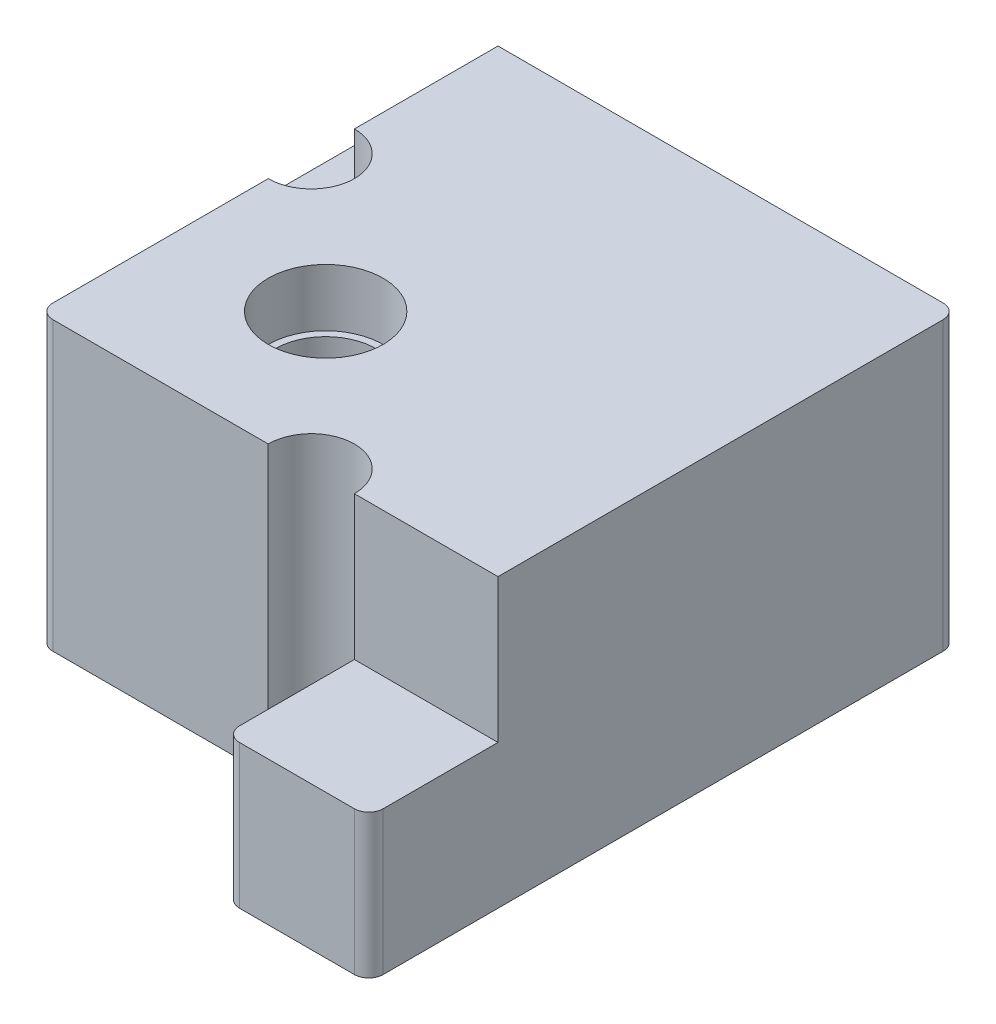
ISO-10303-21;
HEADER;
FILE_DESCRIPTION(('STEP AP214'),'2;1');
FILE_NAME('part.step','',(''),(''),'','','');
FILE_SCHEMA(('AUTOMOTIVE_DESIGN { 1 0 10303 214 1 1 1 1 }'));
ENDSEC;
DATA;
#1=APPLICATION_CONTEXT('core data for automotive mechanical design processes');
#2=APPLICATION_PROTOCOL_DEFINITION('international standard','automotive_design',2000,#1);
#3=PRODUCT_CONTEXT('',#1,'mechanical');
#4=PRODUCT('Part','Part','',(#3));
#5=PRODUCT_RELATED_PRODUCT_CATEGORY('part','',(#4));
#6=PRODUCT_DEFINITION_FORMATION('','',#4);
#7=PRODUCT_DEFINITION_CONTEXT('part definition',#1,'design');
#8=PRODUCT_DEFINITION('design','',#6,#7);
#9=PRODUCT_DEFINITION_SHAPE('','',#8);
#10=(LENGTH_UNIT() NAMED_UNIT(*) SI_UNIT(.MILLI.,.METRE.));
#11=(NAMED_UNIT(*) PLANE_ANGLE_UNIT() SI_UNIT($,.RADIAN.));
#12=(NAMED_UNIT(*) SI_UNIT($,.STERADIAN.) SOLID_ANGLE_UNIT());
#13=UNCERTAINTY_MEASURE_WITH_UNIT(LENGTH_MEASURE(1.E-05),#10,'distance_accuracy_value','');
#14=(GEOMETRIC_REPRESENTATION_CONTEXT(3) GLOBAL_UNCERTAINTY_ASSIGNED_CONTEXT((#13)) GLOBAL_UNIT_ASSIGNED_CONTEXT((#10,
#11,#12)) REPRESENTATION_CONTEXT('',''));
#15=CARTESIAN_POINT('',(0.,0.,0.));
#16=DIRECTION('',(0.,0.,1.));
#17=DIRECTION('',(1.,0.,0.));
#18=AXIS2_PLACEMENT_3D('',#15,#16,#17);
#19=CARTESIAN_POINT('',(0.,10.,0.));
#20=DIRECTION('',(1.,0.,0.));
#21=DIRECTION('',(0.,0.,-1.));
#22=AXIS2_PLACEMENT_3D('',#19,#20,#21);
#23=PLANE('',#22);
#24=DIRECTION('',(0.,0.,1.));
#25=VECTOR('',#24,1.);
#26=CARTESIAN_POINT('',(0.,5.,5.));
#27=LINE('',#26,#25);
#28=CARTESIAN_POINT('',(0.,5.,0.5));
#29=VERTEX_POINT('',#28);
#30=CARTESIAN_POINT('',(0.,5.,4.5));
#31=VERTEX_POINT('',#30);
#32=EDGE_CURVE('E193',#29,#31,#27,.T.);
#33=ORIENTED_EDGE('',*,*,#32,.F.);
#34=DIRECTION('',(0.,-1.,0.));
#35=VECTOR('',#34,1.);
#36=CARTESIAN_POINT('',(0.,10.,0.5));
#37=LINE('',#36,#35);
#38=CARTESIAN_POINT('',(0.,0.,0.5));
#39=VERTEX_POINT('',#38);
#40=EDGE_CURVE('E304',#29,#39,#37,.T.);
#41=ORIENTED_EDGE('',*,*,#40,.T.);
#42=DIRECTION('',(0.,0.,1.));
#43=VECTOR('',#42,1.);
#44=CARTESIAN_POINT('',(0.,0.,0.));
#45=LINE('',#44,#43);
#46=CARTESIAN_POINT('',(0.,0.,4.5));
#47=VERTEX_POINT('',#46);
#48=EDGE_CURVE('E256',#39,#47,#45,.T.);
#49=ORIENTED_EDGE('',*,*,#48,.T.);
#50=DIRECTION('',(0.,-1.,0.));
#51=VECTOR('',#50,1.);
#52=CARTESIAN_POINT('',(0.,10.,4.5));
#53=LINE('',#52,#51);
#54=EDGE_CURVE('E302',#47,#31,#53,.F.);
#55=ORIENTED_EDGE('',*,*,#54,.T.);
#56=EDGE_LOOP('',(#33,#41,#49,#55));
#57=FACE_BOUND('',#56,.T.);
#58=ADVANCED_FACE('F34',(#57),#23,.F.);
#59=CARTESIAN_POINT('',(4.5,10.,5.));
#60=DIRECTION('',(0.,0.,-1.));
#61=DIRECTION('',(-1.,0.,0.));
#62=AXIS2_PLACEMENT_3D('',#59,#60,#61);
#63=PLANE('',#62);
#64=DIRECTION('',(1.,0.,0.));
#65=VECTOR('',#64,1.);
#66=CARTESIAN_POINT('',(4.5,5.,5.));
#67=LINE('',#66,#65);
#68=CARTESIAN_POINT('',(0.500000000000001,5.,5.));
#69=VERTEX_POINT('',#68);
#70=CARTESIAN_POINT('',(4.5,5.,5.));
#71=VERTEX_POINT('',#70);
#72=EDGE_CURVE('E180',#69,#71,#67,.T.);
#73=ORIENTED_EDGE('',*,*,#72,.F.);
#74=DIRECTION('',(0.,-1.,0.));
#75=VECTOR('',#74,1.);
#76=CARTESIAN_POINT('',(0.500000000000001,10.,5.));
#77=LINE('',#76,#75);
#78=CARTESIAN_POINT('',(0.500000000000001,0.,5.));
#79=VERTEX_POINT('',#78);
#80=EDGE_CURVE('E311',#69,#79,#77,.T.);
#81=ORIENTED_EDGE('',*,*,#80,.T.);
#82=DIRECTION('',(1.,0.,0.));
#83=VECTOR('',#82,1.);
#84=CARTESIAN_POINT('',(4.5,0.,5.));
#85=LINE('',#84,#83);
#86=CARTESIAN_POINT('',(4.5,0.,5.));
#87=VERTEX_POINT('',#86);
#88=EDGE_CURVE('E259',#79,#87,#85,.T.);
#89=ORIENTED_EDGE('',*,*,#88,.T.);
#90=DIRECTION('',(0.,-1.,0.));
#91=VECTOR('',#90,1.);
#92=CARTESIAN_POINT('',(4.5,10.,5.));
#93=LINE('',#92,#91);
#94=EDGE_CURVE('E271',#71,#87,#93,.T.);
#95=ORIENTED_EDGE('',*,*,#94,.F.);
#96=EDGE_LOOP('',(#73,#81,#89,#95));
#97=FACE_BOUND('',#96,.T.);
#98=ADVANCED_FACE('F377',(#97),#63,.F.);
#99=CARTESIAN_POINT('',(15.5,10.,16.));
#100=DIRECTION('',(1.,0.,0.));
#101=DIRECTION('',(0.,0.,-1.));
#102=AXIS2_PLACEMENT_3D('',#99,#100,#101);
#103=PLANE('',#102);
#104=DIRECTION('',(0.,0.,1.));
#105=VECTOR('',#104,1.);
#106=CARTESIAN_POINT('',(15.5,0.,16.));
#107=LINE('',#106,#105);
#108=CARTESIAN_POINT('',(15.5,0.,16.));
#109=VERTEX_POINT('',#108);
#110=CARTESIAN_POINT('',(15.5,0.,20.));
#111=VERTEX_POINT('',#110);
#112=EDGE_CURVE('E266',#109,#111,#107,.T.);
#113=ORIENTED_EDGE('',*,*,#112,.T.);
#114=DIRECTION('',(0.,-1.,0.));
#115=VECTOR('',#114,1.);
#116=CARTESIAN_POINT('',(15.5,10.,20.));
#117=LINE('',#116,#115);
#118=CARTESIAN_POINT('',(15.5,5.,20.));
#119=VERTEX_POINT('',#118);
#120=EDGE_CURVE('E49',#111,#119,#117,.F.);
#121=ORIENTED_EDGE('',*,*,#120,.T.);
#122=DIRECTION('',(0.,0.,1.));
#123=VECTOR('',#122,1.);
#124=CARTESIAN_POINT('',(15.5,5.,16.));
#125=LINE('',#124,#123);
#126=CARTESIAN_POINT('',(15.5,5.,16.));
#127=VERTEX_POINT('',#126);
#128=EDGE_CURVE('E200',#127,#119,#125,.T.);
#129=ORIENTED_EDGE('',*,*,#128,.F.);
#130=DIRECTION('',(0.,-1.,0.));
#131=VECTOR('',#130,1.);
#132=CARTESIAN_POINT('',(15.5,10.,16.));
#133=LINE('',#132,#131);
#134=EDGE_CURVE('E251',#127,#109,#133,.T.);
#135=ORIENTED_EDGE('',*,*,#134,.T.);
#136=EDGE_LOOP('',(#113,#121,#129,#135));
#137=FACE_BOUND('',#136,.T.);
#138=ADVANCED_FACE('F347',(#137),#103,.F.);
#139=CARTESIAN_POINT('',(20.5,10.,20.5));
#140=DIRECTION('',(0.,0.,-1.));
#141=DIRECTION('',(-1.,0.,0.));
#142=AXIS2_PLACEMENT_3D('',#139,#140,#141);
#143=PLANE('',#142);
#144=DIRECTION('',(1.,0.,0.));
#145=VECTOR('',#144,1.);
#146=CARTESIAN_POINT('',(15.5,5.,20.5));
#147=LINE('',#146,#145);
#148=CARTESIAN_POINT('',(16.,5.,20.5));
#149=VERTEX_POINT('',#148);
#150=CARTESIAN_POINT('',(20.,5.,20.5));
#151=VERTEX_POINT('',#150);
#152=EDGE_CURVE('E202',#149,#151,#147,.T.);
#153=ORIENTED_EDGE('',*,*,#152,.F.);
#154=DIRECTION('',(0.,-1.,0.));
#155=VECTOR('',#154,1.);
#156=CARTESIAN_POINT('',(16.,10.,20.5));
#157=LINE('',#156,#155);
#158=CARTESIAN_POINT('',(16.,0.,20.5));
#159=VERTEX_POINT('',#158);
#160=EDGE_CURVE('E320',#149,#159,#157,.T.);
#161=ORIENTED_EDGE('',*,*,#160,.T.);
#162=DIRECTION('',(1.,0.,0.));
#163=VECTOR('',#162,1.);
#164=CARTESIAN_POINT('',(20.5,0.,20.5));
#165=LINE('',#164,#163);
#166=CARTESIAN_POINT('',(20.,0.,20.5));
#167=VERTEX_POINT('',#166);
#168=EDGE_CURVE('E244',#159,#167,#165,.T.);
#169=ORIENTED_EDGE('',*,*,#168,.T.);
#170=DIRECTION('',(0.,-1.,0.));
#171=VECTOR('',#170,1.);
#172=CARTESIAN_POINT('',(20.,10.,20.5));
#173=LINE('',#172,#171);
#174=EDGE_CURVE('E57',#167,#151,#173,.F.);
#175=ORIENTED_EDGE('',*,*,#174,.T.);
#176=EDGE_LOOP('',(#153,#161,#169,#175));
#177=FACE_BOUND('',#176,.T.);
#178=ADVANCED_FACE('F340',(#177),#143,.F.);
#179=CARTESIAN_POINT('',(9.5,0.,11.));
#180=DIRECTION('',(0.,1.,0.));
#181=DIRECTION('',(0.,0.,1.));
#182=AXIS2_PLACEMENT_3D('',#179,#180,#181);
#183=CYLINDRICAL_SURFACE('',#182,1.75);
#184=CARTESIAN_POINT('',(9.5,0.,11.));
#185=DIRECTION('',(0.,1.,0.));
#186=DIRECTION('',(0.,0.,1.));
#187=AXIS2_PLACEMENT_3D('',#184,#185,#186);
#188=CIRCLE('',#187,1.75);
#189=CARTESIAN_POINT('',(9.5,0.,12.75));
#190=VERTEX_POINT('',#189);
#191=EDGE_CURVE('E236',#190,#190,#188,.T.);
#192=ORIENTED_EDGE('',*,*,#191,.F.);
#193=EDGE_LOOP('',(#192));
#194=FACE_BOUND('',#193,.T.);
#195=CARTESIAN_POINT('',(9.5,8.,11.));
#196=DIRECTION('',(0.,1.,0.));
#197=DIRECTION('',(0.,0.,1.));
#198=AXIS2_PLACEMENT_3D('',#195,#196,#197);
#199=CIRCLE('',#198,1.75);
#200=CARTESIAN_POINT('',(9.5,8.,12.75));
#201=VERTEX_POINT('',#200);
#202=EDGE_CURVE('E233',#201,#201,#199,.F.);
#203=ORIENTED_EDGE('',*,*,#202,.F.);
#204=EDGE_LOOP('',(#203));
#205=FACE_BOUND('',#204,.T.);
#206=ADVANCED_FACE('F416',(#194,#205),#183,.F.);
#207=CARTESIAN_POINT('',(20.5,10.,0.));
#208=DIRECTION('',(-1.,0.,0.));
#209=DIRECTION('',(0.,0.,1.));
#210=AXIS2_PLACEMENT_3D('',#207,#208,#209);
#211=PLANE('',#210);
#212=DIRECTION('',(0.,0.,-1.));
#213=VECTOR('',#212,1.);
#214=CARTESIAN_POINT('',(20.5,0.,0.));
#215=LINE('',#214,#213);
#216=CARTESIAN_POINT('',(20.5,0.,20.));
#217=VERTEX_POINT('',#216);
#218=CARTESIAN_POINT('',(20.5,0.,0.5));
#219=VERTEX_POINT('',#218);
#220=EDGE_CURVE('E239',#217,#219,#215,.T.);
#221=ORIENTED_EDGE('',*,*,#220,.T.);
#222=DIRECTION('',(0.,-1.,0.));
#223=VECTOR('',#222,1.);
#224=CARTESIAN_POINT('',(20.5,10.,0.5));
#225=LINE('',#224,#223);
#226=CARTESIAN_POINT('',(20.5,10.,0.5));
#227=VERTEX_POINT('',#226);
#228=EDGE_CURVE('E296',#219,#227,#225,.F.);
#229=ORIENTED_EDGE('',*,*,#228,.T.);
#230=DIRECTION('',(0.,0.,-1.));
#231=VECTOR('',#230,1.);
#232=CARTESIAN_POINT('',(20.5,10.,0.));
#233=LINE('',#232,#231);
#234=CARTESIAN_POINT('',(20.5,10.,16.));
#235=VERTEX_POINT('',#234);
#236=EDGE_CURVE('E240',#235,#227,#233,.T.);
#237=ORIENTED_EDGE('',*,*,#236,.F.);
#238=DIRECTION('',(0.,1.,0.));
#239=VECTOR('',#238,1.);
#240=CARTESIAN_POINT('',(20.5,5.,16.));
#241=LINE('',#240,#239);
#242=CARTESIAN_POINT('',(20.5,5.,16.));
#243=VERTEX_POINT('',#242);
#244=EDGE_CURVE('E209',#243,#235,#241,.T.);
#245=ORIENTED_EDGE('',*,*,#244,.F.);
#246=DIRECTION('',(0.,0.,-1.));
#247=VECTOR('',#246,1.);
#248=CARTESIAN_POINT('',(20.5,5.,16.));
#249=LINE('',#248,#247);
#250=CARTESIAN_POINT('',(20.5,5.,20.));
#251=VERTEX_POINT('',#250);
#252=EDGE_CURVE('E204',#251,#243,#249,.T.);
#253=ORIENTED_EDGE('',*,*,#252,.F.);
#254=DIRECTION('',(0.,-1.,0.));
#255=VECTOR('',#254,1.);
#256=CARTESIAN_POINT('',(20.5,10.,20.));
#257=LINE('',#256,#255);
#258=EDGE_CURVE('E293',#251,#217,#257,.T.);
#259=ORIENTED_EDGE('',*,*,#258,.T.);
#260=EDGE_LOOP('',(#221,#229,#237,#245,#253,#259));
#261=FACE_BOUND('',#260,.T.);
#262=ADVANCED_FACE('F332',(#261),#211,.F.);
#263=CARTESIAN_POINT('',(0.,10.,0.));
#264=DIRECTION('',(0.,0.,1.));
#265=DIRECTION('',(1.,0.,0.));
#266=AXIS2_PLACEMENT_3D('',#263,#264,#265);
#267=PLANE('',#266);
#268=DIRECTION('',(-1.,0.,0.));
#269=VECTOR('',#268,1.);
#270=CARTESIAN_POINT('',(0.,10.,0.));
#271=LINE('',#270,#269);
#272=CARTESIAN_POINT('',(20.,10.,0.));
#273=VERTEX_POINT('',#272);
#274=CARTESIAN_POINT('',(4.5,10.,0.));
#275=VERTEX_POINT('',#274);
#276=EDGE_CURVE('E243',#273,#275,#271,.T.);
#277=ORIENTED_EDGE('',*,*,#276,.F.);
#278=DIRECTION('',(0.,-1.,0.));
#279=VECTOR('',#278,1.);
#280=CARTESIAN_POINT('',(20.,10.,0.));
#281=LINE('',#280,#279);
#282=CARTESIAN_POINT('',(20.,0.,0.));
#283=VERTEX_POINT('',#282);
#284=EDGE_CURVE('E278',#273,#283,#281,.T.);
#285=ORIENTED_EDGE('',*,*,#284,.T.);
#286=DIRECTION('',(-1.,0.,0.));
#287=VECTOR('',#286,1.);
#288=CARTESIAN_POINT('',(0.,0.,0.));
#289=LINE('',#288,#287);
#290=CARTESIAN_POINT('',(0.5,0.,0.));
#291=VERTEX_POINT('',#290);
#292=EDGE_CURVE('E254',#283,#291,#289,.T.);
#293=ORIENTED_EDGE('',*,*,#292,.T.);
#294=DIRECTION('',(0.,-1.,0.));
#295=VECTOR('',#294,1.);
#296=CARTESIAN_POINT('',(0.5,10.,0.));
#297=LINE('',#296,#295);
#298=CARTESIAN_POINT('',(0.5,5.,0.));
#299=VERTEX_POINT('',#298);
#300=EDGE_CURVE('E192',#291,#299,#297,.F.);
#301=ORIENTED_EDGE('',*,*,#300,.T.);
#302=DIRECTION('',(-1.,0.,0.));
#303=VECTOR('',#302,1.);
#304=CARTESIAN_POINT('',(4.5,5.,0.));
#305=LINE('',#304,#303);
#306=CARTESIAN_POINT('',(4.5,5.,0.));
#307=VERTEX_POINT('',#306);
#308=EDGE_CURVE('E185',#307,#299,#305,.T.);
#309=ORIENTED_EDGE('',*,*,#308,.F.);
#310=DIRECTION('',(0.,1.,0.));
#311=VECTOR('',#310,1.);
#312=CARTESIAN_POINT('',(4.5,5.,0.));
#313=LINE('',#312,#311);
#314=EDGE_CURVE('E169',#307,#275,#313,.T.);
#315=ORIENTED_EDGE('',*,*,#314,.T.);
#316=EDGE_LOOP('',(#277,#285,#293,#301,#309,#315));
#317=FACE_BOUND('',#316,.T.);
#318=ADVANCED_FACE('F189',(#317),#267,.F.);
#319=CARTESIAN_POINT('',(4.5,10.,5.));
#320=DIRECTION('',(1.,0.,0.));
#321=DIRECTION('',(0.,0.,-1.));
#322=AXIS2_PLACEMENT_3D('',#319,#320,#321);
#323=PLANE('',#322);
#324=DIRECTION('',(0.,0.,1.));
#325=VECTOR('',#324,1.);
#326=CARTESIAN_POINT('',(4.5,0.,5.));
#327=LINE('',#326,#325);
#328=CARTESIAN_POINT('',(4.5,0.,8.));
#329=VERTEX_POINT('',#328);
#330=CARTESIAN_POINT('',(4.5,0.,15.5));
#331=VERTEX_POINT('',#330);
#332=EDGE_CURVE('E261',#329,#331,#327,.T.);
#333=ORIENTED_EDGE('',*,*,#332,.T.);
#334=DIRECTION('',(0.,-1.,0.));
#335=VECTOR('',#334,1.);
#336=CARTESIAN_POINT('',(4.5,10.,15.5));
#337=LINE('',#336,#335);
#338=CARTESIAN_POINT('',(4.5,10.,15.5));
#339=VERTEX_POINT('',#338);
#340=EDGE_CURVE('E317',#331,#339,#337,.F.);
#341=ORIENTED_EDGE('',*,*,#340,.T.);
#342=DIRECTION('',(0.,0.,1.));
#343=VECTOR('',#342,1.);
#344=CARTESIAN_POINT('',(4.5,10.,5.));
#345=LINE('',#344,#343);
#346=CARTESIAN_POINT('',(4.5,10.,8.));
#347=VERTEX_POINT('',#346);
#348=EDGE_CURVE('E246',#347,#339,#345,.T.);
#349=ORIENTED_EDGE('',*,*,#348,.F.);
#350=DIRECTION('',(0.,-1.,0.));
#351=VECTOR('',#350,1.);
#352=CARTESIAN_POINT('',(4.5,10.,8.));
#353=LINE('',#352,#351);
#354=EDGE_CURVE('E225',#347,#329,#353,.T.);
#355=ORIENTED_EDGE('',*,*,#354,.T.);
#356=EDGE_LOOP('',(#333,#341,#349,#355));
#357=FACE_BOUND('',#356,.T.);
#358=ADVANCED_FACE('F366',(#357),#323,.F.);
#359=CARTESIAN_POINT('',(4.5,10.,16.));
#360=DIRECTION('',(0.,0.,-1.));
#361=DIRECTION('',(-1.,0.,0.));
#362=AXIS2_PLACEMENT_3D('',#359,#360,#361);
#363=PLANE('',#362);
#364=DIRECTION('',(1.,0.,0.));
#365=VECTOR('',#364,1.);
#366=CARTESIAN_POINT('',(4.5,10.,16.));
#367=LINE('',#366,#365);
#368=CARTESIAN_POINT('',(5.,10.,16.));
#369=VERTEX_POINT('',#368);
#370=CARTESIAN_POINT('',(12.5,10.,16.));
#371=VERTEX_POINT('',#370);
#372=EDGE_CURVE('E249',#369,#371,#367,.T.);
#373=ORIENTED_EDGE('',*,*,#372,.F.);
#374=DIRECTION('',(0.,-1.,0.));
#375=VECTOR('',#374,1.);
#376=CARTESIAN_POINT('',(5.,10.,16.));
#377=LINE('',#376,#375);
#378=CARTESIAN_POINT('',(5.,0.,16.));
#379=VERTEX_POINT('',#378);
#380=EDGE_CURVE('E314',#369,#379,#377,.T.);
#381=ORIENTED_EDGE('',*,*,#380,.T.);
#382=DIRECTION('',(1.,0.,0.));
#383=VECTOR('',#382,1.);
#384=CARTESIAN_POINT('',(4.5,0.,16.));
#385=LINE('',#384,#383);
#386=CARTESIAN_POINT('',(12.5,0.,16.));
#387=VERTEX_POINT('',#386);
#388=EDGE_CURVE('E264',#379,#387,#385,.T.);
#389=ORIENTED_EDGE('',*,*,#388,.T.);
#390=DIRECTION('',(0.,-1.,0.));
#391=VECTOR('',#390,1.);
#392=CARTESIAN_POINT('',(12.5,10.,16.));
#393=LINE('',#392,#391);
#394=EDGE_CURVE('E216',#371,#387,#393,.T.);
#395=ORIENTED_EDGE('',*,*,#394,.F.);
#396=EDGE_LOOP('',(#373,#381,#389,#395));
#397=FACE_BOUND('',#396,.T.);
#398=ADVANCED_FACE('F358',(#397),#363,.F.);
#399=CARTESIAN_POINT('',(20.5,10.,20.5));
#400=DIRECTION('',(0.,-1.,0.));
#401=DIRECTION('',(0.,0.,-1.));
#402=AXIS2_PLACEMENT_3D('',#399,#400,#401);
#403=PLANE('',#402);
#404=CARTESIAN_POINT('',(9.5,10.,11.));
#405=DIRECTION('',(0.,1.,0.));
#406=DIRECTION('',(0.,0.,1.));
#407=AXIS2_PLACEMENT_3D('',#404,#405,#406);
#408=CIRCLE('',#407,2.);
#409=CARTESIAN_POINT('',(9.5,10.,13.));
#410=VERTEX_POINT('',#409);
#411=EDGE_CURVE('E229',#410,#410,#408,.T.);
#412=ORIENTED_EDGE('',*,*,#411,.F.);
#413=EDGE_LOOP('',(#412));
#414=FACE_BOUND('',#413,.T.);
#415=ORIENTED_EDGE('',*,*,#236,.T.);
#416=CARTESIAN_POINT('',(20.,10.,0.5));
#417=DIRECTION('',(0.,-1.,0.));
#418=DIRECTION('',(0.,0.,-1.));
#419=AXIS2_PLACEMENT_3D('',#416,#417,#418);
#420=CIRCLE('',#419,0.5);
#421=EDGE_CURVE('E300',#227,#273,#420,.F.);
#422=ORIENTED_EDGE('',*,*,#421,.T.);
#423=ORIENTED_EDGE('',*,*,#276,.T.);
#424=DIRECTION('',(0.,0.,-1.));
#425=VECTOR('',#424,1.);
#426=CARTESIAN_POINT('',(4.5,10.,5.));
#427=LINE('',#426,#425);
#428=CARTESIAN_POINT('',(4.5,10.,5.));
#429=VERTEX_POINT('',#428);
#430=EDGE_CURVE('E175',#429,#275,#427,.T.);
#431=ORIENTED_EDGE('',*,*,#430,.F.);
#432=CARTESIAN_POINT('',(4.5,10.,6.5));
#433=DIRECTION('',(0.,-1.,0.));
#434=DIRECTION('',(0.,0.,-1.));
#435=AXIS2_PLACEMENT_3D('',#432,#433,#434);
#436=CIRCLE('',#435,1.5);
#437=EDGE_CURVE('E222',#429,#347,#436,.T.);
#438=ORIENTED_EDGE('',*,*,#437,.T.);
#439=ORIENTED_EDGE('',*,*,#348,.T.);
#440=CARTESIAN_POINT('',(5.,10.,15.5));
#441=DIRECTION('',(0.,-1.,0.));
#442=DIRECTION('',(0.,0.,-1.));
#443=AXIS2_PLACEMENT_3D('',#440,#441,#442);
#444=CIRCLE('',#443,0.5);
#445=EDGE_CURVE('E298',#339,#369,#444,.F.);
#446=ORIENTED_EDGE('',*,*,#445,.T.);
#447=ORIENTED_EDGE('',*,*,#372,.T.);
#448=CARTESIAN_POINT('',(14.,10.,16.));
#449=DIRECTION('',(0.,-1.,0.));
#450=DIRECTION('',(0.,0.,-1.));
#451=AXIS2_PLACEMENT_3D('',#448,#449,#450);
#452=CIRCLE('',#451,1.5);
#453=CARTESIAN_POINT('',(15.5,10.,16.));
#454=VERTEX_POINT('',#453);
#455=EDGE_CURVE('E213',#371,#454,#452,.T.);
#456=ORIENTED_EDGE('',*,*,#455,.T.);
#457=DIRECTION('',(-1.,0.,0.));
#458=VECTOR('',#457,1.);
#459=CARTESIAN_POINT('',(15.5,10.,16.));
#460=LINE('',#459,#458);
#461=EDGE_CURVE('E179',#235,#454,#460,.T.);
#462=ORIENTED_EDGE('',*,*,#461,.F.);
#463=EDGE_LOOP('',(#415,#422,#423,#431,#438,#439,#446,#447,#456,#462));
#464=FACE_BOUND('',#463,.T.);
#465=ADVANCED_FACE('F368',(#414,#464),#403,.F.);
#466=CARTESIAN_POINT('',(20.5,0.,20.5));
#467=DIRECTION('',(0.,-1.,0.));
#468=DIRECTION('',(0.,0.,-1.));
#469=AXIS2_PLACEMENT_3D('',#466,#467,#468);
#470=PLANE('',#469);
#471=ORIENTED_EDGE('',*,*,#292,.F.);
#472=CARTESIAN_POINT('',(20.,0.,0.5));
#473=DIRECTION('',(0.,-1.,0.));
#474=DIRECTION('',(0.,0.,-1.));
#475=AXIS2_PLACEMENT_3D('',#472,#473,#474);
#476=CIRCLE('',#475,0.5);
#477=EDGE_CURVE('E291',#283,#219,#476,.T.);
#478=ORIENTED_EDGE('',*,*,#477,.T.);
#479=ORIENTED_EDGE('',*,*,#220,.F.);
#480=CARTESIAN_POINT('',(20.,0.,20.));
#481=DIRECTION('',(0.,-1.,0.));
#482=DIRECTION('',(0.,0.,-1.));
#483=AXIS2_PLACEMENT_3D('',#480,#481,#482);
#484=CIRCLE('',#483,0.5);
#485=EDGE_CURVE('E281',#217,#167,#484,.T.);
#486=ORIENTED_EDGE('',*,*,#485,.T.);
#487=ORIENTED_EDGE('',*,*,#168,.F.);
#488=CARTESIAN_POINT('',(16.,0.,20.));
#489=DIRECTION('',(0.,-1.,0.));
#490=DIRECTION('',(0.,0.,-1.));
#491=AXIS2_PLACEMENT_3D('',#488,#489,#490);
#492=CIRCLE('',#491,0.5);
#493=EDGE_CURVE('E283',#159,#111,#492,.T.);
#494=ORIENTED_EDGE('',*,*,#493,.T.);
#495=ORIENTED_EDGE('',*,*,#112,.F.);
#496=CARTESIAN_POINT('',(14.,0.,16.));
#497=DIRECTION('',(0.,-1.,0.));
#498=DIRECTION('',(0.,0.,-1.));
#499=AXIS2_PLACEMENT_3D('',#496,#497,#498);
#500=CIRCLE('',#499,1.5);
#501=EDGE_CURVE('E212',#387,#109,#500,.T.);
#502=ORIENTED_EDGE('',*,*,#501,.F.);
#503=ORIENTED_EDGE('',*,*,#388,.F.);
#504=CARTESIAN_POINT('',(5.,0.,15.5));
#505=DIRECTION('',(0.,-1.,0.));
#506=DIRECTION('',(0.,0.,-1.));
#507=AXIS2_PLACEMENT_3D('',#504,#505,#506);
#508=CIRCLE('',#507,0.5);
#509=EDGE_CURVE('E285',#379,#331,#508,.T.);
#510=ORIENTED_EDGE('',*,*,#509,.T.);
#511=ORIENTED_EDGE('',*,*,#332,.F.);
#512=CARTESIAN_POINT('',(4.5,0.,6.5));
#513=DIRECTION('',(0.,-1.,0.));
#514=DIRECTION('',(0.,0.,-1.));
#515=AXIS2_PLACEMENT_3D('',#512,#513,#514);
#516=CIRCLE('',#515,1.5);
#517=EDGE_CURVE('E221',#87,#329,#516,.T.);
#518=ORIENTED_EDGE('',*,*,#517,.F.);
#519=ORIENTED_EDGE('',*,*,#88,.F.);
#520=CARTESIAN_POINT('',(0.500000000000001,0.,4.5));
#521=DIRECTION('',(0.,-1.,0.));
#522=DIRECTION('',(0.,0.,-1.));
#523=AXIS2_PLACEMENT_3D('',#520,#521,#522);
#524=CIRCLE('',#523,0.5);
#525=EDGE_CURVE('E287',#79,#47,#524,.T.);
#526=ORIENTED_EDGE('',*,*,#525,.T.);
#527=ORIENTED_EDGE('',*,*,#48,.F.);
#528=CARTESIAN_POINT('',(0.5,0.,0.5));
#529=DIRECTION('',(0.,-1.,0.));
#530=DIRECTION('',(0.,0.,-1.));
#531=AXIS2_PLACEMENT_3D('',#528,#529,#530);
#532=CIRCLE('',#531,0.5);
#533=EDGE_CURVE('E289',#39,#291,#532,.T.);
#534=ORIENTED_EDGE('',*,*,#533,.T.);
#535=EDGE_LOOP('',(#471,#478,#479,#486,#487,#494,#495,#502,#503,#510,#511,#518,#519,#526,#527,#534));
#536=FACE_BOUND('',#535,.T.);
#537=ORIENTED_EDGE('',*,*,#191,.T.);
#538=EDGE_LOOP('',(#537));
#539=FACE_BOUND('',#538,.T.);
#540=ADVANCED_FACE('F338',(#536,#539),#470,.T.);
#541=CARTESIAN_POINT('',(9.5,8.,11.));
#542=DIRECTION('',(0.,1.,0.));
#543=DIRECTION('',(0.,0.,1.));
#544=AXIS2_PLACEMENT_3D('',#541,#542,#543);
#545=PLANE('',#544);
#546=CARTESIAN_POINT('',(9.5,8.,11.));
#547=DIRECTION('',(0.,1.,0.));
#548=DIRECTION('',(0.,0.,1.));
#549=AXIS2_PLACEMENT_3D('',#546,#547,#548);
#550=CIRCLE('',#549,2.);
#551=CARTESIAN_POINT('',(9.5,8.,13.));
#552=VERTEX_POINT('',#551);
#553=EDGE_CURVE('E230',#552,#552,#550,.T.);
#554=ORIENTED_EDGE('',*,*,#553,.T.);
#555=EDGE_LOOP('',(#554));
#556=FACE_BOUND('',#555,.T.);
#557=ORIENTED_EDGE('',*,*,#202,.T.);
#558=EDGE_LOOP('',(#557));
#559=FACE_BOUND('',#558,.T.);
#560=ADVANCED_FACE('F484',(#556,#559),#545,.T.);
#561=CARTESIAN_POINT('',(9.5,8.,11.));
#562=DIRECTION('',(0.,1.,0.));
#563=DIRECTION('',(0.,0.,1.));
#564=AXIS2_PLACEMENT_3D('',#561,#562,#563);
#565=CYLINDRICAL_SURFACE('',#564,2.);
#566=ORIENTED_EDGE('',*,*,#553,.F.);
#567=EDGE_LOOP('',(#566));
#568=FACE_BOUND('',#567,.T.);
#569=ORIENTED_EDGE('',*,*,#411,.T.);
#570=EDGE_LOOP('',(#569));
#571=FACE_BOUND('',#570,.T.);
#572=ADVANCED_FACE('F574',(#568,#571),#565,.F.);
#573=CARTESIAN_POINT('',(4.5,10.,6.5));
#574=DIRECTION('',(0.,-1.,0.));
#575=DIRECTION('',(0.,0.,-1.));
#576=AXIS2_PLACEMENT_3D('',#573,#574,#575);
#577=CYLINDRICAL_SURFACE('',#576,1.5);
#578=ORIENTED_EDGE('',*,*,#517,.T.);
#579=ORIENTED_EDGE('',*,*,#354,.F.);
#580=ORIENTED_EDGE('',*,*,#437,.F.);
#581=EDGE_CURVE('E272',#429,#71,#93,.T.);
#582=ORIENTED_EDGE('',*,*,#581,.T.);
#583=ORIENTED_EDGE('',*,*,#94,.T.);
#584=EDGE_LOOP('',(#578,#579,#580,#582,#583));
#585=FACE_BOUND('',#584,.T.);
#586=ADVANCED_FACE('F371',(#585),#577,.F.);
#587=CARTESIAN_POINT('',(14.,10.,16.));
#588=DIRECTION('',(0.,-1.,0.));
#589=DIRECTION('',(0.,0.,-1.));
#590=AXIS2_PLACEMENT_3D('',#587,#588,#589);
#591=CYLINDRICAL_SURFACE('',#590,1.5);
#592=ORIENTED_EDGE('',*,*,#501,.T.);
#593=ORIENTED_EDGE('',*,*,#134,.F.);
#594=EDGE_CURVE('E269',#454,#127,#133,.T.);
#595=ORIENTED_EDGE('',*,*,#594,.F.);
#596=ORIENTED_EDGE('',*,*,#455,.F.);
#597=ORIENTED_EDGE('',*,*,#394,.T.);
#598=EDGE_LOOP('',(#592,#593,#595,#596,#597));
#599=FACE_BOUND('',#598,.T.);
#600=ADVANCED_FACE('F351',(#599),#591,.F.);
#601=CARTESIAN_POINT('',(15.5,5.,16.));
#602=DIRECTION('',(0.,0.,-1.));
#603=DIRECTION('',(-1.,0.,0.));
#604=AXIS2_PLACEMENT_3D('',#601,#602,#603);
#605=PLANE('',#604);
#606=ORIENTED_EDGE('',*,*,#461,.T.);
#607=ORIENTED_EDGE('',*,*,#594,.T.);
#608=DIRECTION('',(-1.,0.,0.));
#609=VECTOR('',#608,1.);
#610=CARTESIAN_POINT('',(15.5,5.,16.));
#611=LINE('',#610,#609);
#612=EDGE_CURVE('E206',#243,#127,#611,.T.);
#613=ORIENTED_EDGE('',*,*,#612,.F.);
#614=ORIENTED_EDGE('',*,*,#244,.T.);
#615=EDGE_LOOP('',(#606,#607,#613,#614));
#616=FACE_BOUND('',#615,.T.);
#617=ADVANCED_FACE('F395',(#616),#605,.F.);
#618=CARTESIAN_POINT('',(0.,5.,0.));
#619=DIRECTION('',(0.,1.,0.));
#620=DIRECTION('',(0.,0.,1.));
#621=AXIS2_PLACEMENT_3D('',#618,#619,#620);
#622=PLANE('',#621);
#623=ORIENTED_EDGE('',*,*,#128,.T.);
#624=CARTESIAN_POINT('',(16.,5.,20.));
#625=DIRECTION('',(0.,1.,0.));
#626=DIRECTION('',(0.,0.,1.));
#627=AXIS2_PLACEMENT_3D('',#624,#625,#626);
#628=CIRCLE('',#627,0.5);
#629=EDGE_CURVE('E11',#119,#149,#628,.T.);
#630=ORIENTED_EDGE('',*,*,#629,.T.);
#631=ORIENTED_EDGE('',*,*,#152,.T.);
#632=CARTESIAN_POINT('',(20.,5.,20.));
#633=DIRECTION('',(0.,1.,0.));
#634=DIRECTION('',(0.,0.,1.));
#635=AXIS2_PLACEMENT_3D('',#632,#633,#634);
#636=CIRCLE('',#635,0.5);
#637=EDGE_CURVE('E42',#151,#251,#636,.T.);
#638=ORIENTED_EDGE('',*,*,#637,.T.);
#639=ORIENTED_EDGE('',*,*,#252,.T.);
#640=ORIENTED_EDGE('',*,*,#612,.T.);
#641=EDGE_LOOP('',(#623,#630,#631,#638,#639,#640));
#642=FACE_BOUND('',#641,.T.);
#643=ADVANCED_FACE('F326',(#642),#622,.T.);
#644=CARTESIAN_POINT('',(4.5,5.,5.));
#645=DIRECTION('',(1.,0.,0.));
#646=DIRECTION('',(0.,0.,-1.));
#647=AXIS2_PLACEMENT_3D('',#644,#645,#646);
#648=PLANE('',#647);
#649=ORIENTED_EDGE('',*,*,#430,.T.);
#650=ORIENTED_EDGE('',*,*,#314,.F.);
#651=DIRECTION('',(0.,0.,-1.));
#652=VECTOR('',#651,1.);
#653=CARTESIAN_POINT('',(4.5,5.,5.));
#654=LINE('',#653,#652);
#655=EDGE_CURVE('E172',#71,#307,#654,.T.);
#656=ORIENTED_EDGE('',*,*,#655,.F.);
#657=ORIENTED_EDGE('',*,*,#581,.F.);
#658=EDGE_LOOP('',(#649,#650,#656,#657));
#659=FACE_BOUND('',#658,.T.);
#660=ADVANCED_FACE('F171',(#659),#648,.F.);
#661=CARTESIAN_POINT('',(0.,5.,0.));
#662=DIRECTION('',(0.,1.,0.));
#663=DIRECTION('',(0.,0.,1.));
#664=AXIS2_PLACEMENT_3D('',#661,#662,#663);
#665=PLANE('',#664);
#666=ORIENTED_EDGE('',*,*,#308,.T.);
#667=CARTESIAN_POINT('',(0.5,5.,0.5));
#668=DIRECTION('',(0.,1.,0.));
#669=DIRECTION('',(0.,0.,1.));
#670=AXIS2_PLACEMENT_3D('',#667,#668,#669);
#671=CIRCLE('',#670,0.5);
#672=EDGE_CURVE('E309',#299,#29,#671,.T.);
#673=ORIENTED_EDGE('',*,*,#672,.T.);
#674=ORIENTED_EDGE('',*,*,#32,.T.);
#675=CARTESIAN_POINT('',(0.500000000000001,5.,4.5));
#676=DIRECTION('',(0.,1.,0.));
#677=DIRECTION('',(0.,0.,1.));
#678=AXIS2_PLACEMENT_3D('',#675,#676,#677);
#679=CIRCLE('',#678,0.5);
#680=EDGE_CURVE('E307',#31,#69,#679,.T.);
#681=ORIENTED_EDGE('',*,*,#680,.T.);
#682=ORIENTED_EDGE('',*,*,#72,.T.);
#683=ORIENTED_EDGE('',*,*,#655,.T.);
#684=EDGE_LOOP('',(#666,#673,#674,#681,#682,#683));
#685=FACE_BOUND('',#684,.T.);
#686=ADVANCED_FACE('F184',(#685),#665,.T.);
#687=CARTESIAN_POINT('',(20.,10.,0.5));
#688=DIRECTION('',(0.,-1.,0.));
#689=DIRECTION('',(0.,0.,-1.));
#690=AXIS2_PLACEMENT_3D('',#687,#688,#689);
#691=CYLINDRICAL_SURFACE('',#690,0.5);
#692=ORIENTED_EDGE('',*,*,#421,.F.);
#693=ORIENTED_EDGE('',*,*,#228,.F.);
#694=ORIENTED_EDGE('',*,*,#477,.F.);
#695=ORIENTED_EDGE('',*,*,#284,.F.);
#696=EDGE_LOOP('',(#692,#693,#694,#695));
#697=FACE_BOUND('',#696,.T.);
#698=ADVANCED_FACE('F391',(#697),#691,.T.);
#699=CARTESIAN_POINT('',(0.5,10.,0.5));
#700=DIRECTION('',(0.,-1.,0.));
#701=DIRECTION('',(0.,0.,-1.));
#702=AXIS2_PLACEMENT_3D('',#699,#700,#701);
#703=CYLINDRICAL_SURFACE('',#702,0.5);
#704=ORIENTED_EDGE('',*,*,#672,.F.);
#705=ORIENTED_EDGE('',*,*,#300,.F.);
#706=ORIENTED_EDGE('',*,*,#533,.F.);
#707=ORIENTED_EDGE('',*,*,#40,.F.);
#708=EDGE_LOOP('',(#704,#705,#706,#707));
#709=FACE_BOUND('',#708,.T.);
#710=ADVANCED_FACE('F387',(#709),#703,.T.);
#711=CARTESIAN_POINT('',(0.500000000000001,10.,4.5));
#712=DIRECTION('',(0.,-1.,0.));
#713=DIRECTION('',(0.,0.,-1.));
#714=AXIS2_PLACEMENT_3D('',#711,#712,#713);
#715=CYLINDRICAL_SURFACE('',#714,0.5);
#716=ORIENTED_EDGE('',*,*,#680,.F.);
#717=ORIENTED_EDGE('',*,*,#54,.F.);
#718=ORIENTED_EDGE('',*,*,#525,.F.);
#719=ORIENTED_EDGE('',*,*,#80,.F.);
#720=EDGE_LOOP('',(#716,#717,#718,#719));
#721=FACE_BOUND('',#720,.T.);
#722=ADVANCED_FACE('F381',(#721),#715,.T.);
#723=CARTESIAN_POINT('',(5.,10.,15.5));
#724=DIRECTION('',(0.,-1.,0.));
#725=DIRECTION('',(0.,0.,-1.));
#726=AXIS2_PLACEMENT_3D('',#723,#724,#725);
#727=CYLINDRICAL_SURFACE('',#726,0.5);
#728=ORIENTED_EDGE('',*,*,#445,.F.);
#729=ORIENTED_EDGE('',*,*,#340,.F.);
#730=ORIENTED_EDGE('',*,*,#509,.F.);
#731=ORIENTED_EDGE('',*,*,#380,.F.);
#732=EDGE_LOOP('',(#728,#729,#730,#731));
#733=FACE_BOUND('',#732,.T.);
#734=ADVANCED_FACE('F362',(#733),#727,.T.);
#735=CARTESIAN_POINT('',(16.,10.,20.));
#736=DIRECTION('',(0.,-1.,0.));
#737=DIRECTION('',(0.,0.,-1.));
#738=AXIS2_PLACEMENT_3D('',#735,#736,#737);
#739=CYLINDRICAL_SURFACE('',#738,0.5);
#740=ORIENTED_EDGE('',*,*,#629,.F.);
#741=ORIENTED_EDGE('',*,*,#120,.F.);
#742=ORIENTED_EDGE('',*,*,#493,.F.);
#743=ORIENTED_EDGE('',*,*,#160,.F.);
#744=EDGE_LOOP('',(#740,#741,#742,#743));
#745=FACE_BOUND('',#744,.T.);
#746=ADVANCED_FACE('F344',(#745),#739,.T.);
#747=CARTESIAN_POINT('',(20.,10.,20.));
#748=DIRECTION('',(0.,-1.,0.));
#749=DIRECTION('',(0.,0.,-1.));
#750=AXIS2_PLACEMENT_3D('',#747,#748,#749);
#751=CYLINDRICAL_SURFACE('',#750,0.5);
#752=ORIENTED_EDGE('',*,*,#637,.F.);
#753=ORIENTED_EDGE('',*,*,#174,.F.);
#754=ORIENTED_EDGE('',*,*,#485,.F.);
#755=ORIENTED_EDGE('',*,*,#258,.F.);
#756=EDGE_LOOP('',(#752,#753,#754,#755));
#757=FACE_BOUND('',#756,.T.);
#758=ADVANCED_FACE('F36',(#757),#751,.T.);
#759=CLOSED_SHELL('',(#58,#98,#138,#178,#206,#262,#318,#358,#398,#465,#540,#560,#572,#586,#600,
#617,#643,#660,#686,#698,#710,#722,#734,#746,#758));
#760=MANIFOLD_SOLID_BREP('B2',#759);
#761=ADVANCED_BREP_SHAPE_REPRESENTATION('',(#18,#760),#14);
#762=SHAPE_DEFINITION_REPRESENTATION(#9,#761);
ENDSEC;
END-ISO-10303-21;
